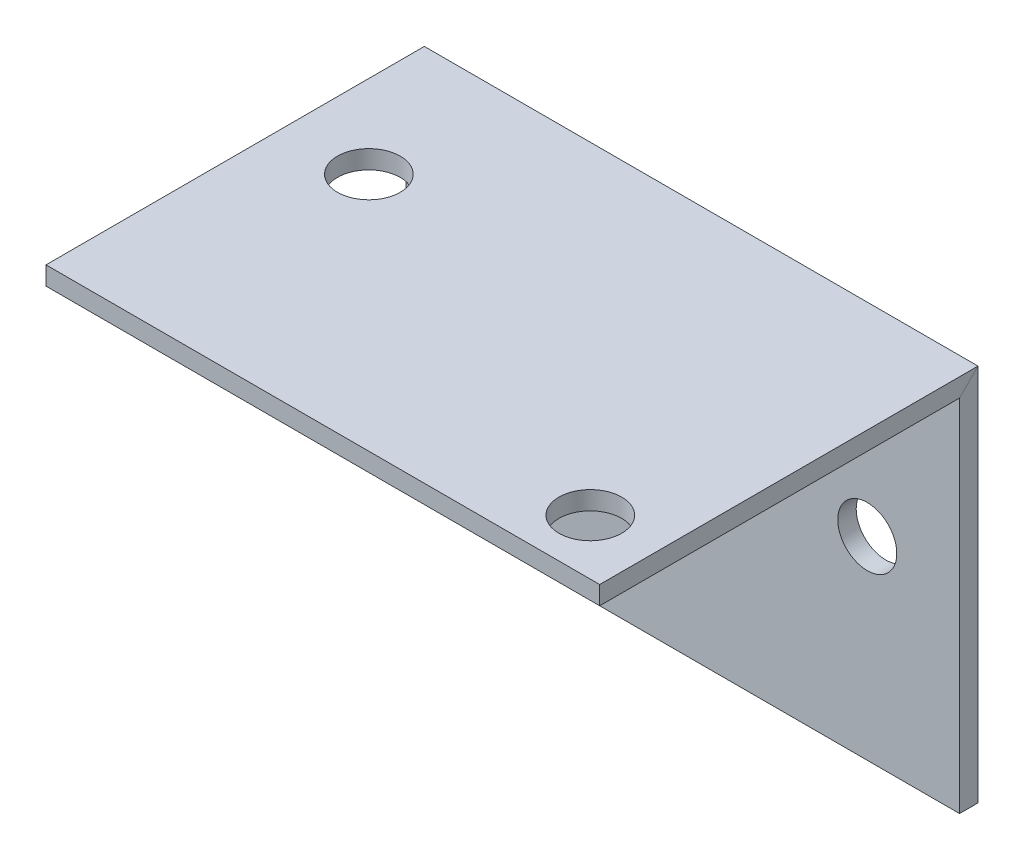
ISO-10303-21;
HEADER;
FILE_DESCRIPTION(('STEP AP214'),'2;1');
FILE_NAME('part.step','',(''),(''),'','','');
FILE_SCHEMA(('AUTOMOTIVE_DESIGN { 1 0 10303 214 1 1 1 1 }'));
ENDSEC;
DATA;
#1=APPLICATION_CONTEXT('core data for automotive mechanical design processes');
#2=APPLICATION_PROTOCOL_DEFINITION('international standard','automotive_design',2000,#1);
#3=PRODUCT_CONTEXT('',#1,'mechanical');
#4=PRODUCT('Part','Part','',(#3));
#5=PRODUCT_RELATED_PRODUCT_CATEGORY('part','',(#4));
#6=PRODUCT_DEFINITION_FORMATION('','',#4);
#7=PRODUCT_DEFINITION_CONTEXT('part definition',#1,'design');
#8=PRODUCT_DEFINITION('design','',#6,#7);
#9=PRODUCT_DEFINITION_SHAPE('','',#8);
#10=(LENGTH_UNIT() NAMED_UNIT(*) SI_UNIT(.MILLI.,.METRE.));
#11=(NAMED_UNIT(*) PLANE_ANGLE_UNIT() SI_UNIT($,.RADIAN.));
#12=(NAMED_UNIT(*) SI_UNIT($,.STERADIAN.) SOLID_ANGLE_UNIT());
#13=UNCERTAINTY_MEASURE_WITH_UNIT(LENGTH_MEASURE(1.E-05),#10,'distance_accuracy_value','');
#14=(GEOMETRIC_REPRESENTATION_CONTEXT(3) GLOBAL_UNCERTAINTY_ASSIGNED_CONTEXT((#13)) GLOBAL_UNIT_ASSIGNED_CONTEXT((#10,
#11,#12)) REPRESENTATION_CONTEXT('',''));
#15=CARTESIAN_POINT('',(0.,0.,0.));
#16=DIRECTION('',(0.,0.,1.));
#17=DIRECTION('',(1.,0.,0.));
#18=AXIS2_PLACEMENT_3D('',#15,#16,#17);
#19=CARTESIAN_POINT('',(0.,-20.,-20.));
#20=DIRECTION('',(0.,1.,0.));
#21=DIRECTION('',(1.,0.,0.));
#22=AXIS2_PLACEMENT_3D('',#19,#20,#21);
#23=PLANE('',#22);
#24=DIRECTION('',(0.,0.,-1.));
#25=VECTOR('',#24,1.);
#26=CARTESIAN_POINT('',(15.0000000000001,-20.,-20.5));
#27=LINE('',#26,#25);
#28=CARTESIAN_POINT('',(15.0000000000001,-20.,-19.5));
#29=VERTEX_POINT('',#28);
#30=CARTESIAN_POINT('',(15.0000000000001,-20.,-20.5));
#31=VERTEX_POINT('',#30);
#32=EDGE_CURVE('E136',#29,#31,#27,.T.);
#33=ORIENTED_EDGE('',*,*,#32,.F.);
#34=DIRECTION('',(1.,0.,0.));
#35=VECTOR('',#34,1.);
#36=CARTESIAN_POINT('',(-14.9999999999999,-20.,-19.5));
#37=LINE('',#36,#35);
#38=CARTESIAN_POINT('',(-14.9999999999999,-20.,-19.5));
#39=VERTEX_POINT('',#38);
#40=EDGE_CURVE('E139',#39,#29,#37,.T.);
#41=ORIENTED_EDGE('',*,*,#40,.F.);
#42=DIRECTION('',(0.,0.,1.));
#43=VECTOR('',#42,1.);
#44=CARTESIAN_POINT('',(-14.9999999999999,-20.,-20.5));
#45=LINE('',#44,#43);
#46=CARTESIAN_POINT('',(-14.9999999999999,-20.,-20.5));
#47=VERTEX_POINT('',#46);
#48=EDGE_CURVE('E70',#47,#39,#45,.T.);
#49=ORIENTED_EDGE('',*,*,#48,.F.);
#50=DIRECTION('',(-1.,0.,0.));
#51=VECTOR('',#50,1.);
#52=CARTESIAN_POINT('',(-14.9999999999999,-20.,-20.5));
#53=LINE('',#52,#51);
#54=EDGE_CURVE('E78',#31,#47,#53,.T.);
#55=ORIENTED_EDGE('',*,*,#54,.F.);
#56=EDGE_LOOP('',(#33,#41,#49,#55));
#57=FACE_BOUND('',#56,.T.);
#58=ADVANCED_FACE('F36',(#57),#23,.F.);
#59=CARTESIAN_POINT('',(0.,0.,0.));
#60=DIRECTION('',(0.,0.,1.));
#61=DIRECTION('',(1.,0.,0.));
#62=AXIS2_PLACEMENT_3D('',#59,#60,#61);
#63=PLANE('',#62);
#64=DIRECTION('',(0.,1.,0.));
#65=VECTOR('',#64,1.);
#66=CARTESIAN_POINT('',(15.0000000000001,0.5,0.));
#67=LINE('',#66,#65);
#68=CARTESIAN_POINT('',(15.0000000000001,-0.499999999999997,0.));
#69=VERTEX_POINT('',#68);
#70=CARTESIAN_POINT('',(15.0000000000001,0.5,0.));
#71=VERTEX_POINT('',#70);
#72=EDGE_CURVE('E123',#69,#71,#67,.T.);
#73=ORIENTED_EDGE('',*,*,#72,.T.);
#74=DIRECTION('',(-1.,0.,0.));
#75=VECTOR('',#74,1.);
#76=CARTESIAN_POINT('',(-14.9999999999999,0.5,0.));
#77=LINE('',#76,#75);
#78=CARTESIAN_POINT('',(-14.9999999999999,0.5,0.));
#79=VERTEX_POINT('',#78);
#80=EDGE_CURVE('E119',#71,#79,#77,.T.);
#81=ORIENTED_EDGE('',*,*,#80,.T.);
#82=DIRECTION('',(0.,-1.,0.));
#83=VECTOR('',#82,1.);
#84=CARTESIAN_POINT('',(-14.9999999999999,0.5,0.));
#85=LINE('',#84,#83);
#86=CARTESIAN_POINT('',(-14.9999999999999,-0.499999999999997,0.));
#87=VERTEX_POINT('',#86);
#88=EDGE_CURVE('E86',#79,#87,#85,.T.);
#89=ORIENTED_EDGE('',*,*,#88,.T.);
#90=DIRECTION('',(1.,0.,0.));
#91=VECTOR('',#90,1.);
#92=CARTESIAN_POINT('',(-14.9999999999999,-0.499999999999997,0.));
#93=LINE('',#92,#91);
#94=EDGE_CURVE('E127',#87,#69,#93,.T.);
#95=ORIENTED_EDGE('',*,*,#94,.T.);
#96=EDGE_LOOP('',(#73,#81,#89,#95));
#97=FACE_BOUND('',#96,.T.);
#98=ADVANCED_FACE('F152',(#97),#63,.T.);
#99=CARTESIAN_POINT('',(-14.9999999999999,0.649999999999998,-20.5));
#100=DIRECTION('',(1.,0.,0.));
#101=DIRECTION('',(0.,0.,-1.));
#102=AXIS2_PLACEMENT_3D('',#99,#100,#101);
#103=PLANE('',#102);
#104=DIRECTION('',(0.,0.707106781186548,-0.707106781186548));
#105=VECTOR('',#104,1.);
#106=CARTESIAN_POINT('',(-14.9999999999999,-9.75,-10.25));
#107=LINE('',#106,#105);
#108=CARTESIAN_POINT('',(-14.9999999999999,-0.499999999999999,-19.5));
#109=VERTEX_POINT('',#108);
#110=CARTESIAN_POINT('',(-14.9999999999999,0.499999999999998,-20.5));
#111=VERTEX_POINT('',#110);
#112=EDGE_CURVE('E109',#109,#111,#107,.T.);
#113=ORIENTED_EDGE('',*,*,#112,.T.);
#114=DIRECTION('',(0.,-1.,0.));
#115=VECTOR('',#114,1.);
#116=CARTESIAN_POINT('',(-14.9999999999999,0.649999999999998,-20.5));
#117=LINE('',#116,#115);
#118=EDGE_CURVE('E39',#111,#47,#117,.T.);
#119=ORIENTED_EDGE('',*,*,#118,.T.);
#120=ORIENTED_EDGE('',*,*,#48,.T.);
#121=DIRECTION('',(0.,-1.,0.));
#122=VECTOR('',#121,1.);
#123=CARTESIAN_POINT('',(-14.9999999999999,0.649999999999997,-19.5));
#124=LINE('',#123,#122);
#125=EDGE_CURVE('E113',#109,#39,#124,.T.);
#126=ORIENTED_EDGE('',*,*,#125,.F.);
#127=EDGE_LOOP('',(#113,#119,#120,#126));
#128=FACE_BOUND('',#127,.T.);
#129=ADVANCED_FACE('F114',(#128),#103,.F.);
#130=CARTESIAN_POINT('',(-14.9999999999999,0.649999999999997,-19.5));
#131=DIRECTION('',(0.,0.,-1.));
#132=DIRECTION('',(0.,1.,0.));
#133=AXIS2_PLACEMENT_3D('',#130,#131,#132);
#134=PLANE('',#133);
#135=CARTESIAN_POINT('',(-10.,-9.5,-19.5));
#136=DIRECTION('',(0.,0.,1.));
#137=DIRECTION('',(1.,0.,0.));
#138=AXIS2_PLACEMENT_3D('',#135,#136,#137);
#139=CIRCLE('',#138,1.6);
#140=CARTESIAN_POINT('',(-8.4,-9.5,-19.5));
#141=VERTEX_POINT('',#140);
#142=EDGE_CURVE('E173',#141,#141,#139,.T.);
#143=ORIENTED_EDGE('',*,*,#142,.F.);
#144=EDGE_LOOP('',(#143));
#145=FACE_BOUND('',#144,.T.);
#146=CARTESIAN_POINT('',(10.,-9.5,-19.5));
#147=DIRECTION('',(0.,0.,1.));
#148=DIRECTION('',(-1.,0.,0.));
#149=AXIS2_PLACEMENT_3D('',#146,#147,#148);
#150=CIRCLE('',#149,1.6);
#151=CARTESIAN_POINT('',(8.4,-9.5,-19.5));
#152=VERTEX_POINT('',#151);
#153=EDGE_CURVE('E170',#152,#152,#150,.T.);
#154=ORIENTED_EDGE('',*,*,#153,.F.);
#155=EDGE_LOOP('',(#154));
#156=FACE_BOUND('',#155,.T.);
#157=DIRECTION('',(-1.,0.,0.));
#158=VECTOR('',#157,1.);
#159=CARTESIAN_POINT('',(-14.9999999999999,-0.499999999999999,-19.5));
#160=LINE('',#159,#158);
#161=CARTESIAN_POINT('',(15.0000000000001,-0.499999999999999,-19.5));
#162=VERTEX_POINT('',#161);
#163=EDGE_CURVE('E11',#162,#109,#160,.T.);
#164=ORIENTED_EDGE('',*,*,#163,.T.);
#165=ORIENTED_EDGE('',*,*,#125,.T.);
#166=ORIENTED_EDGE('',*,*,#40,.T.);
#167=DIRECTION('',(0.,-1.,0.));
#168=VECTOR('',#167,1.);
#169=CARTESIAN_POINT('',(15.0000000000001,0.649999999999997,-19.5));
#170=LINE('',#169,#168);
#171=EDGE_CURVE('E144',#162,#29,#170,.T.);
#172=ORIENTED_EDGE('',*,*,#171,.F.);
#173=EDGE_LOOP('',(#164,#165,#166,#172));
#174=FACE_BOUND('',#173,.T.);
#175=ADVANCED_FACE('F147',(#145,#156,#174),#134,.F.);
#176=CARTESIAN_POINT('',(15.0000000000001,0.649999999999998,-20.5));
#177=DIRECTION('',(-1.,0.,0.));
#178=DIRECTION('',(0.,0.,1.));
#179=AXIS2_PLACEMENT_3D('',#176,#177,#178);
#180=PLANE('',#179);
#181=DIRECTION('',(0.,-0.707106781186548,0.707106781186548));
#182=VECTOR('',#181,1.);
#183=CARTESIAN_POINT('',(15.0000000000001,-9.75,-10.25));
#184=LINE('',#183,#182);
#185=CARTESIAN_POINT('',(15.0000000000001,0.499999999999998,-20.5));
#186=VERTEX_POINT('',#185);
#187=EDGE_CURVE('E45',#186,#162,#184,.T.);
#188=ORIENTED_EDGE('',*,*,#187,.T.);
#189=ORIENTED_EDGE('',*,*,#171,.T.);
#190=ORIENTED_EDGE('',*,*,#32,.T.);
#191=DIRECTION('',(0.,-1.,0.));
#192=VECTOR('',#191,1.);
#193=CARTESIAN_POINT('',(15.0000000000001,0.649999999999998,-20.5));
#194=LINE('',#193,#192);
#195=EDGE_CURVE('E142',#186,#31,#194,.T.);
#196=ORIENTED_EDGE('',*,*,#195,.F.);
#197=EDGE_LOOP('',(#188,#189,#190,#196));
#198=FACE_BOUND('',#197,.T.);
#199=ADVANCED_FACE('F190',(#198),#180,.F.);
#200=CARTESIAN_POINT('',(-14.9999999999999,0.649999999999998,-20.5));
#201=DIRECTION('',(0.,0.,1.));
#202=DIRECTION('',(0.,-1.,0.));
#203=AXIS2_PLACEMENT_3D('',#200,#201,#202);
#204=PLANE('',#203);
#205=CARTESIAN_POINT('',(-10.,-9.5,-20.5));
#206=DIRECTION('',(0.,0.,1.));
#207=DIRECTION('',(1.,0.,0.));
#208=AXIS2_PLACEMENT_3D('',#205,#206,#207);
#209=CIRCLE('',#208,1.6);
#210=CARTESIAN_POINT('',(-8.4,-9.5,-20.5));
#211=VERTEX_POINT('',#210);
#212=EDGE_CURVE('E159',#211,#211,#209,.T.);
#213=ORIENTED_EDGE('',*,*,#212,.T.);
#214=EDGE_LOOP('',(#213));
#215=FACE_BOUND('',#214,.T.);
#216=CARTESIAN_POINT('',(10.,-9.5,-20.5));
#217=DIRECTION('',(0.,0.,1.));
#218=DIRECTION('',(-1.,0.,0.));
#219=AXIS2_PLACEMENT_3D('',#216,#217,#218);
#220=CIRCLE('',#219,1.6);
#221=CARTESIAN_POINT('',(8.4,-9.5,-20.5));
#222=VERTEX_POINT('',#221);
#223=EDGE_CURVE('E167',#222,#222,#220,.T.);
#224=ORIENTED_EDGE('',*,*,#223,.T.);
#225=EDGE_LOOP('',(#224));
#226=FACE_BOUND('',#225,.T.);
#227=DIRECTION('',(1.,0.,0.));
#228=VECTOR('',#227,1.);
#229=CARTESIAN_POINT('',(-14.9999999999999,0.499999999999999,-20.5));
#230=LINE('',#229,#228);
#231=EDGE_CURVE('E104',#111,#186,#230,.T.);
#232=ORIENTED_EDGE('',*,*,#231,.T.);
#233=ORIENTED_EDGE('',*,*,#195,.T.);
#234=ORIENTED_EDGE('',*,*,#54,.T.);
#235=ORIENTED_EDGE('',*,*,#118,.F.);
#236=EDGE_LOOP('',(#232,#233,#234,#235));
#237=FACE_BOUND('',#236,.T.);
#238=ADVANCED_FACE('F112',(#215,#226,#237),#204,.F.);
#239=CARTESIAN_POINT('',(-14.9999999999999,0.5,0.));
#240=DIRECTION('',(0.,-1.,0.));
#241=DIRECTION('',(0.,0.,-1.));
#242=AXIS2_PLACEMENT_3D('',#239,#240,#241);
#243=PLANE('',#242);
#244=CARTESIAN_POINT('',(11.4934083900862,0.500000000000002,-3.00000000000001));
#245=DIRECTION('',(0.,-1.,0.));
#246=DIRECTION('',(0.,0.,-1.));
#247=AXIS2_PLACEMENT_3D('',#244,#245,#246);
#248=CIRCLE('',#247,1.7);
#249=CARTESIAN_POINT('',(11.4934083900862,0.500000000000002,-4.70000000000001));
#250=VERTEX_POINT('',#249);
#251=EDGE_CURVE('E137',#250,#250,#248,.T.);
#252=ORIENTED_EDGE('',*,*,#251,.T.);
#253=EDGE_LOOP('',(#252));
#254=FACE_BOUND('',#253,.T.);
#255=CARTESIAN_POINT('',(-10.5065916099138,0.500000000000001,-13.));
#256=DIRECTION('',(0.,-1.,0.));
#257=DIRECTION('',(0.,0.,-1.));
#258=AXIS2_PLACEMENT_3D('',#255,#256,#257);
#259=CIRCLE('',#258,1.7);
#260=CARTESIAN_POINT('',(-10.5065916099138,0.500000000000001,-14.7));
#261=VERTEX_POINT('',#260);
#262=EDGE_CURVE('E155',#261,#261,#259,.T.);
#263=ORIENTED_EDGE('',*,*,#262,.T.);
#264=EDGE_LOOP('',(#263));
#265=FACE_BOUND('',#264,.T.);
#266=DIRECTION('',(0.,0.,-1.));
#267=VECTOR('',#266,1.);
#268=CARTESIAN_POINT('',(-14.9999999999999,0.5,0.));
#269=LINE('',#268,#267);
#270=EDGE_CURVE('E106',#79,#111,#269,.T.);
#271=ORIENTED_EDGE('',*,*,#270,.F.);
#272=ORIENTED_EDGE('',*,*,#80,.F.);
#273=DIRECTION('',(0.,0.,-1.));
#274=VECTOR('',#273,1.);
#275=CARTESIAN_POINT('',(15.0000000000001,0.5,0.));
#276=LINE('',#275,#274);
#277=EDGE_CURVE('E108',#71,#186,#276,.T.);
#278=ORIENTED_EDGE('',*,*,#277,.T.);
#279=ORIENTED_EDGE('',*,*,#231,.F.);
#280=EDGE_LOOP('',(#271,#272,#278,#279));
#281=FACE_BOUND('',#280,.T.);
#282=ADVANCED_FACE('F105',(#254,#265,#281),#243,.F.);
#283=CARTESIAN_POINT('',(15.0000000000001,0.5,0.));
#284=DIRECTION('',(-1.,0.,0.));
#285=DIRECTION('',(0.,0.,1.));
#286=AXIS2_PLACEMENT_3D('',#283,#284,#285);
#287=PLANE('',#286);
#288=ORIENTED_EDGE('',*,*,#277,.F.);
#289=ORIENTED_EDGE('',*,*,#72,.F.);
#290=DIRECTION('',(0.,0.,-1.));
#291=VECTOR('',#290,1.);
#292=CARTESIAN_POINT('',(15.0000000000001,-0.499999999999997,0.));
#293=LINE('',#292,#291);
#294=EDGE_CURVE('E121',#69,#162,#293,.T.);
#295=ORIENTED_EDGE('',*,*,#294,.T.);
#296=ORIENTED_EDGE('',*,*,#187,.F.);
#297=EDGE_LOOP('',(#288,#289,#295,#296));
#298=FACE_BOUND('',#297,.T.);
#299=ADVANCED_FACE('F213',(#298),#287,.F.);
#300=CARTESIAN_POINT('',(-14.9999999999999,-0.499999999999997,0.));
#301=DIRECTION('',(0.,1.,0.));
#302=DIRECTION('',(0.,0.,1.));
#303=AXIS2_PLACEMENT_3D('',#300,#301,#302);
#304=PLANE('',#303);
#305=CARTESIAN_POINT('',(11.4934083900862,-0.499999999999997,-3.00000000000001));
#306=DIRECTION('',(0.,-1.,0.));
#307=DIRECTION('',(0.,0.,-1.));
#308=AXIS2_PLACEMENT_3D('',#305,#306,#307);
#309=CIRCLE('',#308,1.7);
#310=CARTESIAN_POINT('',(11.4934083900862,-0.499999999999997,-4.70000000000001));
#311=VERTEX_POINT('',#310);
#312=EDGE_CURVE('E162',#311,#311,#309,.T.);
#313=ORIENTED_EDGE('',*,*,#312,.F.);
#314=EDGE_LOOP('',(#313));
#315=FACE_BOUND('',#314,.T.);
#316=CARTESIAN_POINT('',(-10.5065916099138,-0.499999999999998,-13.));
#317=DIRECTION('',(0.,-1.,0.));
#318=DIRECTION('',(0.,0.,-1.));
#319=AXIS2_PLACEMENT_3D('',#316,#317,#318);
#320=CIRCLE('',#319,1.7);
#321=CARTESIAN_POINT('',(-10.5065916099138,-0.499999999999998,-14.7));
#322=VERTEX_POINT('',#321);
#323=EDGE_CURVE('E158',#322,#322,#320,.T.);
#324=ORIENTED_EDGE('',*,*,#323,.F.);
#325=EDGE_LOOP('',(#324));
#326=FACE_BOUND('',#325,.T.);
#327=ORIENTED_EDGE('',*,*,#294,.F.);
#328=ORIENTED_EDGE('',*,*,#94,.F.);
#329=DIRECTION('',(0.,0.,-1.));
#330=VECTOR('',#329,1.);
#331=CARTESIAN_POINT('',(-14.9999999999999,-0.499999999999997,0.));
#332=LINE('',#331,#330);
#333=EDGE_CURVE('E118',#87,#109,#332,.T.);
#334=ORIENTED_EDGE('',*,*,#333,.T.);
#335=ORIENTED_EDGE('',*,*,#163,.F.);
#336=EDGE_LOOP('',(#327,#328,#334,#335));
#337=FACE_BOUND('',#336,.T.);
#338=ADVANCED_FACE('F150',(#315,#326,#337),#304,.F.);
#339=CARTESIAN_POINT('',(-14.9999999999999,0.5,0.));
#340=DIRECTION('',(1.,0.,0.));
#341=DIRECTION('',(0.,0.,-1.));
#342=AXIS2_PLACEMENT_3D('',#339,#340,#341);
#343=PLANE('',#342);
#344=ORIENTED_EDGE('',*,*,#333,.F.);
#345=ORIENTED_EDGE('',*,*,#88,.F.);
#346=ORIENTED_EDGE('',*,*,#270,.T.);
#347=ORIENTED_EDGE('',*,*,#112,.F.);
#348=EDGE_LOOP('',(#344,#345,#346,#347));
#349=FACE_BOUND('',#348,.T.);
#350=ADVANCED_FACE('F117',(#349),#343,.F.);
#351=CARTESIAN_POINT('',(-10.5065916099138,0.500000000000001,-13.));
#352=DIRECTION('',(0.,-1.,0.));
#353=DIRECTION('',(0.,0.,-1.));
#354=AXIS2_PLACEMENT_3D('',#351,#352,#353);
#355=CYLINDRICAL_SURFACE('',#354,1.7);
#356=ORIENTED_EDGE('',*,*,#262,.F.);
#357=EDGE_LOOP('',(#356));
#358=FACE_BOUND('',#357,.T.);
#359=ORIENTED_EDGE('',*,*,#323,.T.);
#360=EDGE_LOOP('',(#359));
#361=FACE_BOUND('',#360,.T.);
#362=ADVANCED_FACE('F201',(#358,#361),#355,.F.);
#363=CARTESIAN_POINT('',(11.4934083900862,0.500000000000002,-3.00000000000001));
#364=DIRECTION('',(0.,-1.,0.));
#365=DIRECTION('',(0.,0.,-1.));
#366=AXIS2_PLACEMENT_3D('',#363,#364,#365);
#367=CYLINDRICAL_SURFACE('',#366,1.7);
#368=ORIENTED_EDGE('',*,*,#251,.F.);
#369=EDGE_LOOP('',(#368));
#370=FACE_BOUND('',#369,.T.);
#371=ORIENTED_EDGE('',*,*,#312,.T.);
#372=EDGE_LOOP('',(#371));
#373=FACE_BOUND('',#372,.T.);
#374=ADVANCED_FACE('F195',(#370,#373),#367,.F.);
#375=CARTESIAN_POINT('',(10.,-9.5,-20.5));
#376=DIRECTION('',(0.,0.,1.));
#377=DIRECTION('',(1.,0.,0.));
#378=AXIS2_PLACEMENT_3D('',#375,#376,#377);
#379=CYLINDRICAL_SURFACE('',#378,1.6);
#380=ORIENTED_EDGE('',*,*,#223,.F.);
#381=EDGE_LOOP('',(#380));
#382=FACE_BOUND('',#381,.T.);
#383=ORIENTED_EDGE('',*,*,#153,.T.);
#384=EDGE_LOOP('',(#383));
#385=FACE_BOUND('',#384,.T.);
#386=ADVANCED_FACE('F184',(#382,#385),#379,.F.);
#387=CARTESIAN_POINT('',(-10.,-9.5,-20.5));
#388=DIRECTION('',(0.,0.,1.));
#389=DIRECTION('',(1.,0.,0.));
#390=AXIS2_PLACEMENT_3D('',#387,#388,#389);
#391=CYLINDRICAL_SURFACE('',#390,1.6);
#392=ORIENTED_EDGE('',*,*,#212,.F.);
#393=EDGE_LOOP('',(#392));
#394=FACE_BOUND('',#393,.T.);
#395=ORIENTED_EDGE('',*,*,#142,.T.);
#396=EDGE_LOOP('',(#395));
#397=FACE_BOUND('',#396,.T.);
#398=ADVANCED_FACE('F181',(#394,#397),#391,.F.);
#399=CLOSED_SHELL('',(#58,#98,#129,#175,#199,#238,#282,#299,#338,#350,#362,#374,#386,#398));
#400=MANIFOLD_SOLID_BREP('B2',#399);
#401=ADVANCED_BREP_SHAPE_REPRESENTATION('',(#18,#400),#14);
#402=SHAPE_DEFINITION_REPRESENTATION(#9,#401);
ENDSEC;
END-ISO-10303-21;
